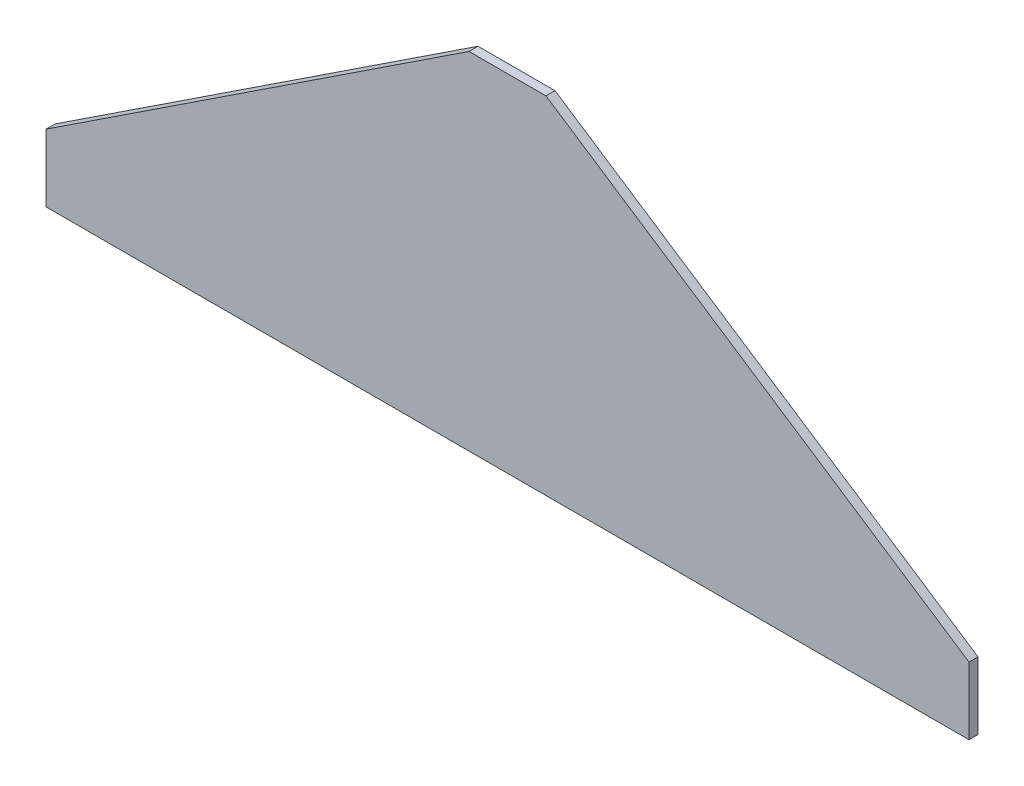
ISO-10303-21;
HEADER;
FILE_DESCRIPTION(('STEP AP214'),'2;1');
FILE_NAME('part.step','',(''),(''),'','','');
FILE_SCHEMA(('AUTOMOTIVE_DESIGN { 1 0 10303 214 1 1 1 1 }'));
ENDSEC;
DATA;
#1=APPLICATION_CONTEXT('core data for automotive mechanical design processes');
#2=APPLICATION_PROTOCOL_DEFINITION('international standard','automotive_design',2000,#1);
#3=PRODUCT_CONTEXT('',#1,'mechanical');
#4=PRODUCT('Part','Part','',(#3));
#5=PRODUCT_RELATED_PRODUCT_CATEGORY('part','',(#4));
#6=PRODUCT_DEFINITION_FORMATION('','',#4);
#7=PRODUCT_DEFINITION_CONTEXT('part definition',#1,'design');
#8=PRODUCT_DEFINITION('design','',#6,#7);
#9=PRODUCT_DEFINITION_SHAPE('','',#8);
#10=(LENGTH_UNIT() NAMED_UNIT(*) SI_UNIT(.MILLI.,.METRE.));
#11=(NAMED_UNIT(*) PLANE_ANGLE_UNIT() SI_UNIT($,.RADIAN.));
#12=(NAMED_UNIT(*) SI_UNIT($,.STERADIAN.) SOLID_ANGLE_UNIT());
#13=UNCERTAINTY_MEASURE_WITH_UNIT(LENGTH_MEASURE(1.E-05),#10,'distance_accuracy_value','');
#14=(GEOMETRIC_REPRESENTATION_CONTEXT(3) GLOBAL_UNCERTAINTY_ASSIGNED_CONTEXT((#13)) GLOBAL_UNIT_ASSIGNED_CONTEXT((#10,
#11,#12)) REPRESENTATION_CONTEXT('',''));
#15=CARTESIAN_POINT('',(0.,0.,0.));
#16=DIRECTION('',(0.,0.,1.));
#17=DIRECTION('',(1.,0.,0.));
#18=AXIS2_PLACEMENT_3D('',#15,#16,#17);
#19=CARTESIAN_POINT('',(609.6,-228.6,11.90625));
#20=DIRECTION('',(-1.,0.,0.));
#21=DIRECTION('',(0.,0.,1.));
#22=AXIS2_PLACEMENT_3D('',#19,#20,#21);
#23=PLANE('',#22);
#24=DIRECTION('',(0.,1.,0.));
#25=VECTOR('',#24,1.);
#26=CARTESIAN_POINT('',(609.6,-228.6,0.));
#27=LINE('',#26,#25);
#28=CARTESIAN_POINT('',(609.6,-228.6,0.));
#29=VERTEX_POINT('',#28);
#30=CARTESIAN_POINT('',(609.6,-139.700000000001,0.));
#31=VERTEX_POINT('',#30);
#32=EDGE_CURVE('E118',#29,#31,#27,.T.);
#33=ORIENTED_EDGE('',*,*,#32,.T.);
#34=DIRECTION('',(0.,0.,1.));
#35=VECTOR('',#34,1.);
#36=CARTESIAN_POINT('',(609.6,-139.700000000001,11.90625));
#37=LINE('',#36,#35);
#38=CARTESIAN_POINT('',(609.6,-139.700000000001,11.90625));
#39=VERTEX_POINT('',#38);
#40=EDGE_CURVE('E11',#31,#39,#37,.T.);
#41=ORIENTED_EDGE('',*,*,#40,.T.);
#42=DIRECTION('',(0.,1.,0.));
#43=VECTOR('',#42,1.);
#44=CARTESIAN_POINT('',(609.6,-228.6,11.90625));
#45=LINE('',#44,#43);
#46=CARTESIAN_POINT('',(609.6,-228.6,11.90625));
#47=VERTEX_POINT('',#46);
#48=EDGE_CURVE('E124',#47,#39,#45,.T.);
#49=ORIENTED_EDGE('',*,*,#48,.F.);
#50=DIRECTION('',(0.,0.,-1.));
#51=VECTOR('',#50,1.);
#52=CARTESIAN_POINT('',(609.6,-228.6,11.90625));
#53=LINE('',#52,#51);
#54=EDGE_CURVE('E110',#47,#29,#53,.T.);
#55=ORIENTED_EDGE('',*,*,#54,.T.);
#56=EDGE_LOOP('',(#33,#41,#49,#55));
#57=FACE_BOUND('',#56,.T.);
#58=ADVANCED_FACE('F35',(#57),#23,.F.);
#59=CARTESIAN_POINT('',(-609.6,228.6,11.90625));
#60=DIRECTION('',(0.,-1.,0.));
#61=DIRECTION('',(0.,0.,-1.));
#62=AXIS2_PLACEMENT_3D('',#59,#60,#61);
#63=PLANE('',#62);
#64=DIRECTION('',(-1.,0.,0.));
#65=VECTOR('',#64,1.);
#66=CARTESIAN_POINT('',(-609.6,228.6,0.));
#67=LINE('',#66,#65);
#68=CARTESIAN_POINT('',(50.7999999999971,228.6,0.));
#69=VERTEX_POINT('',#68);
#70=CARTESIAN_POINT('',(-50.7999999999977,228.6,0.));
#71=VERTEX_POINT('',#70);
#72=EDGE_CURVE('E120',#69,#71,#67,.T.);
#73=ORIENTED_EDGE('',*,*,#72,.T.);
#74=DIRECTION('',(0.,0.,1.));
#75=VECTOR('',#74,1.);
#76=CARTESIAN_POINT('',(-50.7999999999975,228.6,11.90625));
#77=LINE('',#76,#75);
#78=CARTESIAN_POINT('',(-50.7999999999977,228.6,11.90625));
#79=VERTEX_POINT('',#78);
#80=EDGE_CURVE('E57',#71,#79,#77,.T.);
#81=ORIENTED_EDGE('',*,*,#80,.T.);
#82=DIRECTION('',(-1.,0.,0.));
#83=VECTOR('',#82,1.);
#84=CARTESIAN_POINT('',(-609.6,228.6,11.90625));
#85=LINE('',#84,#83);
#86=CARTESIAN_POINT('',(50.7999999999971,228.6,11.90625));
#87=VERTEX_POINT('',#86);
#88=EDGE_CURVE('E100',#87,#79,#85,.T.);
#89=ORIENTED_EDGE('',*,*,#88,.F.);
#90=DIRECTION('',(0.,0.,-1.));
#91=VECTOR('',#90,1.);
#92=CARTESIAN_POINT('',(50.7999999999973,228.6,11.90625));
#93=LINE('',#92,#91);
#94=EDGE_CURVE('E131',#87,#69,#93,.T.);
#95=ORIENTED_EDGE('',*,*,#94,.T.);
#96=EDGE_LOOP('',(#73,#81,#89,#95));
#97=FACE_BOUND('',#96,.T.);
#98=ADVANCED_FACE('F139',(#97),#63,.F.);
#99=CARTESIAN_POINT('',(-609.6,-228.6,11.90625));
#100=DIRECTION('',(1.,0.,0.));
#101=DIRECTION('',(0.,0.,-1.));
#102=AXIS2_PLACEMENT_3D('',#99,#100,#101);
#103=PLANE('',#102);
#104=DIRECTION('',(0.,-1.,0.));
#105=VECTOR('',#104,1.);
#106=CARTESIAN_POINT('',(-609.6,-228.6,11.90625));
#107=LINE('',#106,#105);
#108=CARTESIAN_POINT('',(-609.6,-139.700000000004,11.90625));
#109=VERTEX_POINT('',#108);
#110=CARTESIAN_POINT('',(-609.6,-228.6,11.90625));
#111=VERTEX_POINT('',#110);
#112=EDGE_CURVE('E90',#109,#111,#107,.T.);
#113=ORIENTED_EDGE('',*,*,#112,.F.);
#114=DIRECTION('',(0.,0.,-1.));
#115=VECTOR('',#114,1.);
#116=CARTESIAN_POINT('',(-609.6,-139.700000000004,11.90625));
#117=LINE('',#116,#115);
#118=CARTESIAN_POINT('',(-609.6,-139.700000000004,0.));
#119=VERTEX_POINT('',#118);
#120=EDGE_CURVE('E109',#109,#119,#117,.T.);
#121=ORIENTED_EDGE('',*,*,#120,.T.);
#122=DIRECTION('',(0.,-1.,0.));
#123=VECTOR('',#122,1.);
#124=CARTESIAN_POINT('',(-609.6,-228.6,0.));
#125=LINE('',#124,#123);
#126=CARTESIAN_POINT('',(-609.6,-228.6,0.));
#127=VERTEX_POINT('',#126);
#128=EDGE_CURVE('E106',#119,#127,#125,.T.);
#129=ORIENTED_EDGE('',*,*,#128,.T.);
#130=DIRECTION('',(0.,0.,-1.));
#131=VECTOR('',#130,1.);
#132=CARTESIAN_POINT('',(-609.6,-228.6,11.90625));
#133=LINE('',#132,#131);
#134=EDGE_CURVE('E103',#111,#127,#133,.T.);
#135=ORIENTED_EDGE('',*,*,#134,.F.);
#136=EDGE_LOOP('',(#113,#121,#129,#135));
#137=FACE_BOUND('',#136,.T.);
#138=ADVANCED_FACE('F104',(#137),#103,.F.);
#139=CARTESIAN_POINT('',(-609.6,-228.6,11.90625));
#140=DIRECTION('',(0.,1.,0.));
#141=DIRECTION('',(0.,0.,1.));
#142=AXIS2_PLACEMENT_3D('',#139,#140,#141);
#143=PLANE('',#142);
#144=DIRECTION('',(1.,0.,0.));
#145=VECTOR('',#144,1.);
#146=CARTESIAN_POINT('',(-609.6,-228.6,0.));
#147=LINE('',#146,#145);
#148=EDGE_CURVE('E123',#127,#29,#147,.T.);
#149=ORIENTED_EDGE('',*,*,#148,.T.);
#150=ORIENTED_EDGE('',*,*,#54,.F.);
#151=DIRECTION('',(1.,0.,0.));
#152=VECTOR('',#151,1.);
#153=CARTESIAN_POINT('',(-609.6,-228.6,11.90625));
#154=LINE('',#153,#152);
#155=EDGE_CURVE('E94',#111,#47,#154,.T.);
#156=ORIENTED_EDGE('',*,*,#155,.F.);
#157=ORIENTED_EDGE('',*,*,#134,.T.);
#158=EDGE_LOOP('',(#149,#150,#156,#157));
#159=FACE_BOUND('',#158,.T.);
#160=ADVANCED_FACE('F112',(#159),#143,.F.);
#161=CARTESIAN_POINT('',(0.,0.,11.90625));
#162=DIRECTION('',(0.,0.,-1.));
#163=DIRECTION('',(-1.,0.,0.));
#164=AXIS2_PLACEMENT_3D('',#161,#162,#163);
#165=PLANE('',#164);
#166=ORIENTED_EDGE('',*,*,#88,.T.);
#167=DIRECTION('',(0.834958204616833,0.550313362133825,0.));
#168=VECTOR('',#167,1.);
#169=CARTESIAN_POINT('',(-609.6,-139.700000000004,11.90625));
#170=LINE('',#169,#168);
#171=EDGE_CURVE('E44',#79,#109,#170,.F.);
#172=ORIENTED_EDGE('',*,*,#171,.T.);
#173=ORIENTED_EDGE('',*,*,#112,.T.);
#174=ORIENTED_EDGE('',*,*,#155,.T.);
#175=ORIENTED_EDGE('',*,*,#48,.T.);
#176=DIRECTION('',(0.834958204616835,-0.550313362133822,0.));
#177=VECTOR('',#176,1.);
#178=CARTESIAN_POINT('',(50.7999999999973,228.6,11.90625));
#179=LINE('',#178,#177);
#180=EDGE_CURVE('E135',#39,#87,#179,.F.);
#181=ORIENTED_EDGE('',*,*,#180,.T.);
#182=EDGE_LOOP('',(#166,#172,#173,#174,#175,#181));
#183=FACE_BOUND('',#182,.T.);
#184=ADVANCED_FACE('F92',(#183),#165,.F.);
#185=CARTESIAN_POINT('',(0.,0.,0.));
#186=DIRECTION('',(0.,0.,-1.));
#187=DIRECTION('',(-1.,0.,0.));
#188=AXIS2_PLACEMENT_3D('',#185,#186,#187);
#189=PLANE('',#188);
#190=ORIENTED_EDGE('',*,*,#128,.F.);
#191=DIRECTION('',(-0.834958204616833,-0.550313362133825,0.));
#192=VECTOR('',#191,1.);
#193=CARTESIAN_POINT('',(-120.423622614332,182.711703276916,0.));
#194=LINE('',#193,#192);
#195=EDGE_CURVE('E129',#119,#71,#194,.F.);
#196=ORIENTED_EDGE('',*,*,#195,.T.);
#197=ORIENTED_EDGE('',*,*,#72,.F.);
#198=DIRECTION('',(-0.834958204616835,0.550313362133822,0.));
#199=VECTOR('',#198,1.);
#200=CARTESIAN_POINT('',(120.423622614331,182.711703276917,0.));
#201=LINE('',#200,#199);
#202=EDGE_CURVE('E127',#69,#31,#201,.F.);
#203=ORIENTED_EDGE('',*,*,#202,.T.);
#204=ORIENTED_EDGE('',*,*,#32,.F.);
#205=ORIENTED_EDGE('',*,*,#148,.F.);
#206=EDGE_LOOP('',(#190,#196,#197,#203,#204,#205));
#207=FACE_BOUND('',#206,.T.);
#208=ADVANCED_FACE('F143',(#207),#189,.T.);
#209=CARTESIAN_POINT('',(-609.6,-139.700000000004,11.90625));
#210=DIRECTION('',(0.550313362133825,-0.834958204616833,0.));
#211=DIRECTION('',(0.,0.,-1.));
#212=AXIS2_PLACEMENT_3D('',#209,#210,#211);
#213=PLANE('',#212);
#214=ORIENTED_EDGE('',*,*,#171,.F.);
#215=ORIENTED_EDGE('',*,*,#80,.F.);
#216=ORIENTED_EDGE('',*,*,#195,.F.);
#217=ORIENTED_EDGE('',*,*,#120,.F.);
#218=EDGE_LOOP('',(#214,#215,#216,#217));
#219=FACE_BOUND('',#218,.T.);
#220=ADVANCED_FACE('F153',(#219),#213,.F.);
#221=CARTESIAN_POINT('',(50.7999999999973,228.6,11.90625));
#222=DIRECTION('',(-0.550313362133822,-0.834958204616835,0.));
#223=DIRECTION('',(0.,0.,-1.));
#224=AXIS2_PLACEMENT_3D('',#221,#222,#223);
#225=PLANE('',#224);
#226=ORIENTED_EDGE('',*,*,#180,.F.);
#227=ORIENTED_EDGE('',*,*,#40,.F.);
#228=ORIENTED_EDGE('',*,*,#202,.F.);
#229=ORIENTED_EDGE('',*,*,#94,.F.);
#230=EDGE_LOOP('',(#226,#227,#228,#229));
#231=FACE_BOUND('',#230,.T.);
#232=ADVANCED_FACE('F38',(#231),#225,.F.);
#233=CLOSED_SHELL('',(#58,#98,#138,#160,#184,#208,#220,#232));
#234=MANIFOLD_SOLID_BREP('B2',#233);
#235=ADVANCED_BREP_SHAPE_REPRESENTATION('',(#18,#234),#14);
#236=SHAPE_DEFINITION_REPRESENTATION(#9,#235);
ENDSEC;
END-ISO-10303-21;
